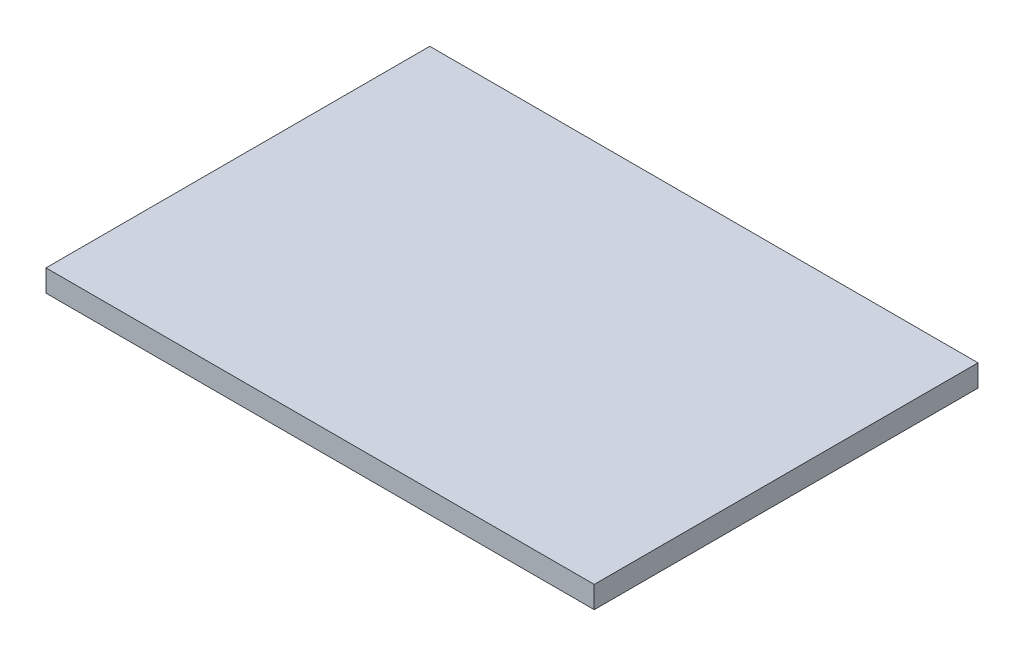
ISO-10303-21;
HEADER;
FILE_DESCRIPTION(('STEP AP214'),'2;1');
FILE_NAME('part.step','',(''),(''),'','','');
FILE_SCHEMA(('AUTOMOTIVE_DESIGN { 1 0 10303 214 1 1 1 1 }'));
ENDSEC;
DATA;
#1=APPLICATION_CONTEXT('core data for automotive mechanical design processes');
#2=APPLICATION_PROTOCOL_DEFINITION('international standard','automotive_design',2000,#1);
#3=PRODUCT_CONTEXT('',#1,'mechanical');
#4=PRODUCT('Part','Part','',(#3));
#5=PRODUCT_RELATED_PRODUCT_CATEGORY('part','',(#4));
#6=PRODUCT_DEFINITION_FORMATION('','',#4);
#7=PRODUCT_DEFINITION_CONTEXT('part definition',#1,'design');
#8=PRODUCT_DEFINITION('design','',#6,#7);
#9=PRODUCT_DEFINITION_SHAPE('','',#8);
#10=(LENGTH_UNIT() NAMED_UNIT(*) SI_UNIT(.MILLI.,.METRE.));
#11=(NAMED_UNIT(*) PLANE_ANGLE_UNIT() SI_UNIT($,.RADIAN.));
#12=(NAMED_UNIT(*) SI_UNIT($,.STERADIAN.) SOLID_ANGLE_UNIT());
#13=UNCERTAINTY_MEASURE_WITH_UNIT(LENGTH_MEASURE(1.E-05),#10,'distance_accuracy_value','');
#14=(GEOMETRIC_REPRESENTATION_CONTEXT(3) GLOBAL_UNCERTAINTY_ASSIGNED_CONTEXT((#13)) GLOBAL_UNIT_ASSIGNED_CONTEXT((#10,
#11,#12)) REPRESENTATION_CONTEXT('',''));
#15=CARTESIAN_POINT('',(0.,0.,0.));
#16=DIRECTION('',(0.,0.,1.));
#17=DIRECTION('',(1.,0.,0.));
#18=AXIS2_PLACEMENT_3D('',#15,#16,#17);
#19=CARTESIAN_POINT('',(250.,20.,-175.));
#20=DIRECTION('',(-1.,0.,0.));
#21=DIRECTION('',(0.,0.,1.));
#22=AXIS2_PLACEMENT_3D('',#19,#20,#21);
#23=PLANE('',#22);
#24=DIRECTION('',(0.,0.,-1.));
#25=VECTOR('',#24,1.);
#26=CARTESIAN_POINT('',(250.,0.,-175.));
#27=LINE('',#26,#25);
#28=CARTESIAN_POINT('',(250.,0.,175.));
#29=VERTEX_POINT('',#28);
#30=CARTESIAN_POINT('',(250.,0.,-175.));
#31=VERTEX_POINT('',#30);
#32=EDGE_CURVE('E96',#29,#31,#27,.T.);
#33=ORIENTED_EDGE('',*,*,#32,.T.);
#34=DIRECTION('',(0.,-1.,0.));
#35=VECTOR('',#34,1.);
#36=CARTESIAN_POINT('',(250.,20.,-175.));
#37=LINE('',#36,#35);
#38=CARTESIAN_POINT('',(250.,20.,-175.));
#39=VERTEX_POINT('',#38);
#40=EDGE_CURVE('E11',#39,#31,#37,.T.);
#41=ORIENTED_EDGE('',*,*,#40,.F.);
#42=DIRECTION('',(0.,0.,-1.));
#43=VECTOR('',#42,1.);
#44=CARTESIAN_POINT('',(250.,20.,-175.));
#45=LINE('',#44,#43);
#46=CARTESIAN_POINT('',(250.,20.,175.));
#47=VERTEX_POINT('',#46);
#48=EDGE_CURVE('E84',#47,#39,#45,.T.);
#49=ORIENTED_EDGE('',*,*,#48,.F.);
#50=DIRECTION('',(0.,-1.,0.));
#51=VECTOR('',#50,1.);
#52=CARTESIAN_POINT('',(250.,20.,175.));
#53=LINE('',#52,#51);
#54=EDGE_CURVE('E92',#47,#29,#53,.T.);
#55=ORIENTED_EDGE('',*,*,#54,.T.);
#56=EDGE_LOOP('',(#33,#41,#49,#55));
#57=FACE_BOUND('',#56,.T.);
#58=ADVANCED_FACE('F33',(#57),#23,.F.);
#59=CARTESIAN_POINT('',(-250.,20.,-175.));
#60=DIRECTION('',(0.,0.,1.));
#61=DIRECTION('',(1.,0.,0.));
#62=AXIS2_PLACEMENT_3D('',#59,#60,#61);
#63=PLANE('',#62);
#64=DIRECTION('',(-1.,0.,0.));
#65=VECTOR('',#64,1.);
#66=CARTESIAN_POINT('',(-250.,0.,-175.));
#67=LINE('',#66,#65);
#68=CARTESIAN_POINT('',(-250.,0.,-175.));
#69=VERTEX_POINT('',#68);
#70=EDGE_CURVE('E88',#31,#69,#67,.T.);
#71=ORIENTED_EDGE('',*,*,#70,.T.);
#72=DIRECTION('',(0.,-1.,0.));
#73=VECTOR('',#72,1.);
#74=CARTESIAN_POINT('',(-250.,20.,-175.));
#75=LINE('',#74,#73);
#76=CARTESIAN_POINT('',(-250.,20.,-175.));
#77=VERTEX_POINT('',#76);
#78=EDGE_CURVE('E41',#77,#69,#75,.T.);
#79=ORIENTED_EDGE('',*,*,#78,.F.);
#80=DIRECTION('',(-1.,0.,0.));
#81=VECTOR('',#80,1.);
#82=CARTESIAN_POINT('',(-250.,20.,-175.));
#83=LINE('',#82,#81);
#84=EDGE_CURVE('E79',#39,#77,#83,.T.);
#85=ORIENTED_EDGE('',*,*,#84,.F.);
#86=ORIENTED_EDGE('',*,*,#40,.T.);
#87=EDGE_LOOP('',(#71,#79,#85,#86));
#88=FACE_BOUND('',#87,.T.);
#89=ADVANCED_FACE('F87',(#88),#63,.F.);
#90=CARTESIAN_POINT('',(-250.,20.,-175.));
#91=DIRECTION('',(1.,0.,0.));
#92=DIRECTION('',(0.,0.,-1.));
#93=AXIS2_PLACEMENT_3D('',#90,#91,#92);
#94=PLANE('',#93);
#95=DIRECTION('',(0.,0.,1.));
#96=VECTOR('',#95,1.);
#97=CARTESIAN_POINT('',(-250.,0.,-175.));
#98=LINE('',#97,#96);
#99=CARTESIAN_POINT('',(-250.,0.,175.));
#100=VERTEX_POINT('',#99);
#101=EDGE_CURVE('E66',#69,#100,#98,.T.);
#102=ORIENTED_EDGE('',*,*,#101,.T.);
#103=DIRECTION('',(0.,-1.,0.));
#104=VECTOR('',#103,1.);
#105=CARTESIAN_POINT('',(-250.,20.,175.));
#106=LINE('',#105,#104);
#107=CARTESIAN_POINT('',(-250.,20.,175.));
#108=VERTEX_POINT('',#107);
#109=EDGE_CURVE('E89',#108,#100,#106,.T.);
#110=ORIENTED_EDGE('',*,*,#109,.F.);
#111=DIRECTION('',(0.,0.,1.));
#112=VECTOR('',#111,1.);
#113=CARTESIAN_POINT('',(-250.,20.,-175.));
#114=LINE('',#113,#112);
#115=EDGE_CURVE('E82',#77,#108,#114,.T.);
#116=ORIENTED_EDGE('',*,*,#115,.F.);
#117=ORIENTED_EDGE('',*,*,#78,.T.);
#118=EDGE_LOOP('',(#102,#110,#116,#117));
#119=FACE_BOUND('',#118,.T.);
#120=ADVANCED_FACE('F90',(#119),#94,.F.);
#121=CARTESIAN_POINT('',(-250.,20.,175.));
#122=DIRECTION('',(0.,0.,-1.));
#123=DIRECTION('',(-1.,0.,0.));
#124=AXIS2_PLACEMENT_3D('',#121,#122,#123);
#125=PLANE('',#124);
#126=DIRECTION('',(1.,0.,0.));
#127=VECTOR('',#126,1.);
#128=CARTESIAN_POINT('',(-250.,0.,175.));
#129=LINE('',#128,#127);
#130=EDGE_CURVE('E72',#100,#29,#129,.T.);
#131=ORIENTED_EDGE('',*,*,#130,.T.);
#132=ORIENTED_EDGE('',*,*,#54,.F.);
#133=DIRECTION('',(1.,0.,0.));
#134=VECTOR('',#133,1.);
#135=CARTESIAN_POINT('',(-250.,20.,175.));
#136=LINE('',#135,#134);
#137=EDGE_CURVE('E49',#108,#47,#136,.T.);
#138=ORIENTED_EDGE('',*,*,#137,.F.);
#139=ORIENTED_EDGE('',*,*,#109,.T.);
#140=EDGE_LOOP('',(#131,#132,#138,#139));
#141=FACE_BOUND('',#140,.T.);
#142=ADVANCED_FACE('F103',(#141),#125,.F.);
#143=CARTESIAN_POINT('',(0.,20.,0.));
#144=DIRECTION('',(0.,1.,0.));
#145=DIRECTION('',(0.,0.,1.));
#146=AXIS2_PLACEMENT_3D('',#143,#144,#145);
#147=PLANE('',#146);
#148=ORIENTED_EDGE('',*,*,#48,.T.);
#149=ORIENTED_EDGE('',*,*,#84,.T.);
#150=ORIENTED_EDGE('',*,*,#115,.T.);
#151=ORIENTED_EDGE('',*,*,#137,.T.);
#152=EDGE_LOOP('',(#148,#149,#150,#151));
#153=FACE_BOUND('',#152,.T.);
#154=ADVANCED_FACE('F80',(#153),#147,.T.);
#155=CARTESIAN_POINT('',(0.,0.,0.));
#156=DIRECTION('',(0.,1.,0.));
#157=DIRECTION('',(0.,0.,1.));
#158=AXIS2_PLACEMENT_3D('',#155,#156,#157);
#159=PLANE('',#158);
#160=ORIENTED_EDGE('',*,*,#32,.F.);
#161=ORIENTED_EDGE('',*,*,#130,.F.);
#162=ORIENTED_EDGE('',*,*,#101,.F.);
#163=ORIENTED_EDGE('',*,*,#70,.F.);
#164=EDGE_LOOP('',(#160,#161,#162,#163));
#165=FACE_BOUND('',#164,.T.);
#166=ADVANCED_FACE('F106',(#165),#159,.F.);
#167=CLOSED_SHELL('',(#58,#89,#120,#142,#154,#166));
#168=MANIFOLD_SOLID_BREP('B2',#167);
#169=ADVANCED_BREP_SHAPE_REPRESENTATION('',(#18,#168),#14);
#170=SHAPE_DEFINITION_REPRESENTATION(#9,#169);
ENDSEC;
END-ISO-10303-21;
